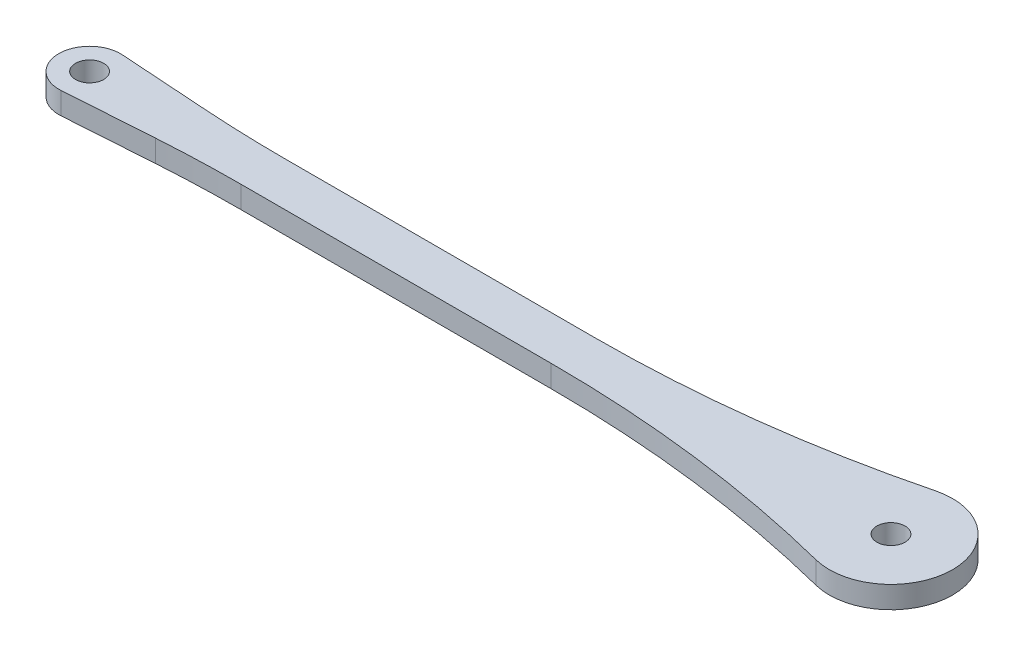
ISO-10303-21;
HEADER;
FILE_DESCRIPTION(('STEP AP214'),'2;1');
FILE_NAME('part.step','',(''),(''),'','','');
FILE_SCHEMA(('AUTOMOTIVE_DESIGN { 1 0 10303 214 1 1 1 1 }'));
ENDSEC;
DATA;
#1=APPLICATION_CONTEXT('core data for automotive mechanical design processes');
#2=APPLICATION_PROTOCOL_DEFINITION('international standard','automotive_design',2000,#1);
#3=PRODUCT_CONTEXT('',#1,'mechanical');
#4=PRODUCT('Part','Part','',(#3));
#5=PRODUCT_RELATED_PRODUCT_CATEGORY('part','',(#4));
#6=PRODUCT_DEFINITION_FORMATION('','',#4);
#7=PRODUCT_DEFINITION_CONTEXT('part definition',#1,'design');
#8=PRODUCT_DEFINITION('design','',#6,#7);
#9=PRODUCT_DEFINITION_SHAPE('','',#8);
#10=(LENGTH_UNIT() NAMED_UNIT(*) SI_UNIT(.MILLI.,.METRE.));
#11=(NAMED_UNIT(*) PLANE_ANGLE_UNIT() SI_UNIT($,.RADIAN.));
#12=(NAMED_UNIT(*) SI_UNIT($,.STERADIAN.) SOLID_ANGLE_UNIT());
#13=UNCERTAINTY_MEASURE_WITH_UNIT(LENGTH_MEASURE(1.E-05),#10,'distance_accuracy_value','');
#14=(GEOMETRIC_REPRESENTATION_CONTEXT(3) GLOBAL_UNCERTAINTY_ASSIGNED_CONTEXT((#13)) GLOBAL_UNIT_ASSIGNED_CONTEXT((#10,
#11,#12)) REPRESENTATION_CONTEXT('',''));
#15=CARTESIAN_POINT('',(0.,0.,0.));
#16=DIRECTION('',(0.,0.,1.));
#17=DIRECTION('',(1.,0.,0.));
#18=AXIS2_PLACEMENT_3D('',#15,#16,#17);
#19=CARTESIAN_POINT('',(0.038280708421993,3.175,-0.569714366068761));
#20=DIRECTION('',(0.0670416368978515,0.,-0.997750178612891));
#21=DIRECTION('',(-0.997750178612891,0.,-0.0670416368978515));
#22=AXIS2_PLACEMENT_3D('',#19,#20,#21);
#23=PLANE('',#22);
#24=DIRECTION('',(0.997750178612891,0.,0.0670416368978515));
#25=VECTOR('',#24,1.);
#26=CARTESIAN_POINT('',(0.038280708421993,3.175,-0.569714366068761));
#27=LINE('',#26,#25);
#28=CARTESIAN_POINT('',(-57.4869999239889,3.175,-4.4349995439343));
#29=VERTEX_POINT('',#28);
#30=CARTESIAN_POINT('',(-44.6882895003525,3.175,-3.57501824262793));
#31=VERTEX_POINT('',#30);
#32=EDGE_CURVE('E133',#29,#31,#27,.T.);
#33=ORIENTED_EDGE('',*,*,#32,.T.);
#34=DIRECTION('',(0.,-1.,0.));
#35=VECTOR('',#34,1.);
#36=CARTESIAN_POINT('',(-44.6882895003525,3.175,-3.57501824262793));
#37=LINE('',#36,#35);
#38=CARTESIAN_POINT('',(-44.6882895003525,0.,-3.57501824262793));
#39=VERTEX_POINT('',#38);
#40=EDGE_CURVE('E203',#31,#39,#37,.T.);
#41=ORIENTED_EDGE('',*,*,#40,.T.);
#42=DIRECTION('',(0.997750178612891,0.,0.0670416368978515));
#43=VECTOR('',#42,1.);
#44=CARTESIAN_POINT('',(0.038280708421993,0.,-0.569714366068761));
#45=LINE('',#44,#43);
#46=CARTESIAN_POINT('',(-57.4869999239889,0.,-4.4349995439343));
#47=VERTEX_POINT('',#46);
#48=EDGE_CURVE('E135',#47,#39,#45,.T.);
#49=ORIENTED_EDGE('',*,*,#48,.F.);
#50=DIRECTION('',(0.,-1.,0.));
#51=VECTOR('',#50,1.);
#52=CARTESIAN_POINT('',(-57.4869999239889,3.175,-4.4349995439343));
#53=LINE('',#52,#51);
#54=EDGE_CURVE('E130',#29,#47,#53,.T.);
#55=ORIENTED_EDGE('',*,*,#54,.F.);
#56=EDGE_LOOP('',(#33,#41,#49,#55));
#57=FACE_BOUND('',#56,.T.);
#58=ADVANCED_FACE('F46',(#57),#23,.T.);
#59=CARTESIAN_POINT('',(-57.7849999999999,3.175,0.));
#60=DIRECTION('',(0.,-1.,0.));
#61=DIRECTION('',(0.,0.,-1.));
#62=AXIS2_PLACEMENT_3D('',#59,#60,#61);
#63=CYLINDRICAL_SURFACE('',#62,4.445);
#64=CARTESIAN_POINT('',(-57.7849999999999,0.,0.));
#65=DIRECTION('',(0.,1.,0.));
#66=DIRECTION('',(0.,0.,1.));
#67=AXIS2_PLACEMENT_3D('',#64,#65,#66);
#68=CIRCLE('',#67,4.445);
#69=CARTESIAN_POINT('',(-57.4869999239889,0.,4.4349995439343));
#70=VERTEX_POINT('',#69);
#71=EDGE_CURVE('E178',#47,#70,#68,.T.);
#72=ORIENTED_EDGE('',*,*,#71,.T.);
#73=DIRECTION('',(0.,-1.,0.));
#74=VECTOR('',#73,1.);
#75=CARTESIAN_POINT('',(-57.4869999239889,3.175,4.4349995439343));
#76=LINE('',#75,#74);
#77=CARTESIAN_POINT('',(-57.4869999239889,3.175,4.4349995439343));
#78=VERTEX_POINT('',#77);
#79=EDGE_CURVE('E136',#78,#70,#76,.T.);
#80=ORIENTED_EDGE('',*,*,#79,.F.);
#81=CARTESIAN_POINT('',(-57.7849999999999,3.175,0.));
#82=DIRECTION('',(0.,1.,0.));
#83=DIRECTION('',(0.,0.,1.));
#84=AXIS2_PLACEMENT_3D('',#81,#82,#83);
#85=CIRCLE('',#84,4.445);
#86=EDGE_CURVE('E141',#29,#78,#85,.T.);
#87=ORIENTED_EDGE('',*,*,#86,.F.);
#88=ORIENTED_EDGE('',*,*,#54,.T.);
#89=EDGE_LOOP('',(#72,#80,#87,#88));
#90=FACE_BOUND('',#89,.T.);
#91=ADVANCED_FACE('F144',(#90),#63,.T.);
#92=CARTESIAN_POINT('',(0.0382807084219928,3.175,0.569714366068757));
#93=DIRECTION('',(0.0670416368978516,0.,0.997750178612891));
#94=DIRECTION('',(0.997750178612891,0.,-0.0670416368978516));
#95=AXIS2_PLACEMENT_3D('',#92,#93,#94);
#96=PLANE('',#95);
#97=DIRECTION('',(-0.997750178612891,0.,0.0670416368978516));
#98=VECTOR('',#97,1.);
#99=CARTESIAN_POINT('',(0.0382807084219928,0.,0.569714366068757));
#100=LINE('',#99,#98);
#101=CARTESIAN_POINT('',(-44.6882895003525,0.,3.57501824262793));
#102=VERTEX_POINT('',#101);
#103=EDGE_CURVE('E179',#102,#70,#100,.T.);
#104=ORIENTED_EDGE('',*,*,#103,.F.);
#105=DIRECTION('',(0.,-1.,0.));
#106=VECTOR('',#105,1.);
#107=CARTESIAN_POINT('',(-44.6882895003525,3.175,3.57501824262793));
#108=LINE('',#107,#106);
#109=CARTESIAN_POINT('',(-44.6882895003525,3.175,3.57501824262793));
#110=VERTEX_POINT('',#109);
#111=EDGE_CURVE('E65',#102,#110,#108,.F.);
#112=ORIENTED_EDGE('',*,*,#111,.T.);
#113=DIRECTION('',(-0.997750178612891,0.,0.0670416368978516));
#114=VECTOR('',#113,1.);
#115=CARTESIAN_POINT('',(0.0382807084219928,3.175,0.569714366068757));
#116=LINE('',#115,#114);
#117=EDGE_CURVE('E150',#110,#78,#116,.T.);
#118=ORIENTED_EDGE('',*,*,#117,.T.);
#119=ORIENTED_EDGE('',*,*,#79,.T.);
#120=EDGE_LOOP('',(#104,#112,#118,#119));
#121=FACE_BOUND('',#120,.T.);
#122=ADVANCED_FACE('F254',(#121),#96,.T.);
#123=CARTESIAN_POINT('',(0.,3.175,3.175));
#124=DIRECTION('',(0.,0.,1.));
#125=DIRECTION('',(1.,0.,0.));
#126=AXIS2_PLACEMENT_3D('',#123,#124,#125);
#127=PLANE('',#126);
#128=DIRECTION('',(-1.,0.,0.));
#129=VECTOR('',#128,1.);
#130=CARTESIAN_POINT('',(0.,3.175,3.175));
#131=LINE('',#130,#129);
#132=CARTESIAN_POINT('',(11.9460921268843,3.175,3.175));
#133=VERTEX_POINT('',#132);
#134=CARTESIAN_POINT('',(-32.7682864599144,3.175,3.175));
#135=VERTEX_POINT('',#134);
#136=EDGE_CURVE('E163',#133,#135,#131,.T.);
#137=ORIENTED_EDGE('',*,*,#136,.T.);
#138=DIRECTION('',(0.,-1.,0.));
#139=VECTOR('',#138,1.);
#140=CARTESIAN_POINT('',(-32.7682864599144,0.,3.175));
#141=LINE('',#140,#139);
#142=CARTESIAN_POINT('',(-32.7682864599144,0.,3.175));
#143=VERTEX_POINT('',#142);
#144=EDGE_CURVE('E208',#135,#143,#141,.T.);
#145=ORIENTED_EDGE('',*,*,#144,.T.);
#146=DIRECTION('',(-1.,0.,0.));
#147=VECTOR('',#146,1.);
#148=CARTESIAN_POINT('',(0.,0.,3.175));
#149=LINE('',#148,#147);
#150=CARTESIAN_POINT('',(11.9460921268843,0.,3.175));
#151=VERTEX_POINT('',#150);
#152=EDGE_CURVE('E185',#151,#143,#149,.T.);
#153=ORIENTED_EDGE('',*,*,#152,.F.);
#154=DIRECTION('',(0.,-1.,0.));
#155=VECTOR('',#154,1.);
#156=CARTESIAN_POINT('',(11.9460921268843,3.175,3.175));
#157=LINE('',#156,#155);
#158=EDGE_CURVE('E210',#151,#133,#157,.F.);
#159=ORIENTED_EDGE('',*,*,#158,.T.);
#160=EDGE_LOOP('',(#137,#145,#153,#159));
#161=FACE_BOUND('',#160,.T.);
#162=ADVANCED_FACE('F234',(#161),#127,.T.);
#163=CARTESIAN_POINT('',(57.7850000000001,3.175,0.));
#164=DIRECTION('',(0.,-1.,0.));
#165=DIRECTION('',(0.,0.,-1.));
#166=AXIS2_PLACEMENT_3D('',#163,#164,#165);
#167=CYLINDRICAL_SURFACE('',#166,8.89);
#168=CARTESIAN_POINT('',(57.7850000000001,0.,0.));
#169=DIRECTION('',(0.,1.,0.));
#170=DIRECTION('',(0.,0.,1.));
#171=AXIS2_PLACEMENT_3D('',#168,#169,#170);
#172=CIRCLE('',#171,8.89);
#173=CARTESIAN_POINT('',(55.6021948631851,0.,8.61785714285714));
#174=VERTEX_POINT('',#173);
#175=CARTESIAN_POINT('',(55.6021948631851,0.,-8.61785714285714));
#176=VERTEX_POINT('',#175);
#177=EDGE_CURVE('E184',#174,#176,#172,.T.);
#178=ORIENTED_EDGE('',*,*,#177,.T.);
#179=DIRECTION('',(0.,-1.,0.));
#180=VECTOR('',#179,1.);
#181=CARTESIAN_POINT('',(55.6021948631851,3.175,-8.61785714285714));
#182=LINE('',#181,#180);
#183=CARTESIAN_POINT('',(55.6021948631851,3.175,-8.61785714285714));
#184=VERTEX_POINT('',#183);
#185=EDGE_CURVE('E204',#176,#184,#182,.F.);
#186=ORIENTED_EDGE('',*,*,#185,.T.);
#187=CARTESIAN_POINT('',(57.7850000000001,3.175,0.));
#188=DIRECTION('',(0.,1.,0.));
#189=DIRECTION('',(0.,0.,1.));
#190=AXIS2_PLACEMENT_3D('',#187,#188,#189);
#191=CIRCLE('',#190,8.89);
#192=CARTESIAN_POINT('',(55.6021948631851,3.175,8.61785714285714));
#193=VERTEX_POINT('',#192);
#194=EDGE_CURVE('E164',#193,#184,#191,.T.);
#195=ORIENTED_EDGE('',*,*,#194,.F.);
#196=DIRECTION('',(0.,-1.,0.));
#197=VECTOR('',#196,1.);
#198=CARTESIAN_POINT('',(55.6021948631851,3.175,8.61785714285714));
#199=LINE('',#198,#197);
#200=EDGE_CURVE('E196',#193,#174,#199,.T.);
#201=ORIENTED_EDGE('',*,*,#200,.T.);
#202=EDGE_LOOP('',(#178,#186,#195,#201));
#203=FACE_BOUND('',#202,.T.);
#204=ADVANCED_FACE('F241',(#203),#167,.T.);
#205=CARTESIAN_POINT('',(0.,3.175,-3.175));
#206=DIRECTION('',(0.,0.,1.));
#207=DIRECTION('',(1.,0.,0.));
#208=AXIS2_PLACEMENT_3D('',#205,#206,#207);
#209=PLANE('',#208);
#210=DIRECTION('',(-1.,0.,0.));
#211=VECTOR('',#210,1.);
#212=CARTESIAN_POINT('',(0.,3.175,-3.175));
#213=LINE('',#212,#211);
#214=CARTESIAN_POINT('',(11.9460921268843,3.175,-3.175));
#215=VERTEX_POINT('',#214);
#216=CARTESIAN_POINT('',(-32.7682864599145,3.175,-3.175));
#217=VERTEX_POINT('',#216);
#218=EDGE_CURVE('E166',#215,#217,#213,.T.);
#219=ORIENTED_EDGE('',*,*,#218,.F.);
#220=DIRECTION('',(0.,1.,0.));
#221=VECTOR('',#220,1.);
#222=CARTESIAN_POINT('',(11.9460921268843,0.,-3.175));
#223=LINE('',#222,#221);
#224=CARTESIAN_POINT('',(11.9460921268843,0.,-3.175));
#225=VERTEX_POINT('',#224);
#226=EDGE_CURVE('E198',#215,#225,#223,.F.);
#227=ORIENTED_EDGE('',*,*,#226,.T.);
#228=DIRECTION('',(-1.,0.,0.));
#229=VECTOR('',#228,1.);
#230=CARTESIAN_POINT('',(0.,0.,-3.175));
#231=LINE('',#230,#229);
#232=CARTESIAN_POINT('',(-32.7682864599145,0.,-3.175));
#233=VERTEX_POINT('',#232);
#234=EDGE_CURVE('E189',#225,#233,#231,.T.);
#235=ORIENTED_EDGE('',*,*,#234,.T.);
#236=DIRECTION('',(0.,-1.,0.));
#237=VECTOR('',#236,1.);
#238=CARTESIAN_POINT('',(-32.7682864599145,3.175,-3.175));
#239=LINE('',#238,#237);
#240=EDGE_CURVE('E139',#233,#217,#239,.F.);
#241=ORIENTED_EDGE('',*,*,#240,.T.);
#242=EDGE_LOOP('',(#219,#227,#235,#241));
#243=FACE_BOUND('',#242,.T.);
#244=ADVANCED_FACE('F247',(#243),#209,.F.);
#245=CARTESIAN_POINT('',(-57.7849999999999,3.175,0.));
#246=DIRECTION('',(0.,-1.,0.));
#247=DIRECTION('',(0.,0.,-1.));
#248=AXIS2_PLACEMENT_3D('',#245,#246,#247);
#249=CYLINDRICAL_SURFACE('',#248,2.03200000000001);
#250=CARTESIAN_POINT('',(-57.7849999999999,3.175,0.));
#251=DIRECTION('',(0.,1.,0.));
#252=DIRECTION('',(0.,0.,1.));
#253=AXIS2_PLACEMENT_3D('',#250,#251,#252);
#254=CIRCLE('',#253,2.03200000000001);
#255=CARTESIAN_POINT('',(-57.7849999999999,3.175,2.03200000000001));
#256=VERTEX_POINT('',#255);
#257=EDGE_CURVE('E153',#256,#256,#254,.T.);
#258=ORIENTED_EDGE('',*,*,#257,.T.);
#259=EDGE_LOOP('',(#258));
#260=FACE_BOUND('',#259,.T.);
#261=CARTESIAN_POINT('',(-57.7849999999999,0.,0.));
#262=DIRECTION('',(0.,1.,0.));
#263=DIRECTION('',(0.,0.,1.));
#264=AXIS2_PLACEMENT_3D('',#261,#262,#263);
#265=CIRCLE('',#264,2.03200000000001);
#266=CARTESIAN_POINT('',(-57.7849999999999,0.,2.03200000000001));
#267=VERTEX_POINT('',#266);
#268=EDGE_CURVE('E172',#267,#267,#265,.T.);
#269=ORIENTED_EDGE('',*,*,#268,.F.);
#270=EDGE_LOOP('',(#269));
#271=FACE_BOUND('',#270,.T.);
#272=ADVANCED_FACE('F271',(#260,#271),#249,.F.);
#273=CARTESIAN_POINT('',(57.7850000000001,3.175,0.));
#274=DIRECTION('',(0.,-1.,0.));
#275=DIRECTION('',(0.,0.,-1.));
#276=AXIS2_PLACEMENT_3D('',#273,#274,#275);
#277=CYLINDRICAL_SURFACE('',#276,2.03200000000001);
#278=CARTESIAN_POINT('',(57.7850000000001,3.175,0.));
#279=DIRECTION('',(0.,1.,0.));
#280=DIRECTION('',(0.,0.,1.));
#281=AXIS2_PLACEMENT_3D('',#278,#279,#280);
#282=CIRCLE('',#281,2.03200000000001);
#283=CARTESIAN_POINT('',(57.7850000000001,3.175,2.03200000000001));
#284=VERTEX_POINT('',#283);
#285=EDGE_CURVE('E171',#284,#284,#282,.T.);
#286=ORIENTED_EDGE('',*,*,#285,.T.);
#287=EDGE_LOOP('',(#286));
#288=FACE_BOUND('',#287,.T.);
#289=CARTESIAN_POINT('',(57.7850000000001,0.,0.));
#290=DIRECTION('',(0.,1.,0.));
#291=DIRECTION('',(0.,0.,1.));
#292=AXIS2_PLACEMENT_3D('',#289,#290,#291);
#293=CIRCLE('',#292,2.03200000000001);
#294=CARTESIAN_POINT('',(57.7850000000001,0.,2.03200000000001));
#295=VERTEX_POINT('',#294);
#296=EDGE_CURVE('E160',#295,#295,#293,.T.);
#297=ORIENTED_EDGE('',*,*,#296,.F.);
#298=EDGE_LOOP('',(#297));
#299=FACE_BOUND('',#298,.T.);
#300=ADVANCED_FACE('F276',(#288,#299),#277,.F.);
#301=CARTESIAN_POINT('',(0.,3.175,0.));
#302=DIRECTION('',(0.,1.,0.));
#303=DIRECTION('',(0.,0.,1.));
#304=AXIS2_PLACEMENT_3D('',#301,#302,#303);
#305=PLANE('',#304);
#306=ORIENTED_EDGE('',*,*,#257,.F.);
#307=EDGE_LOOP('',(#306));
#308=FACE_BOUND('',#307,.T.);
#309=ORIENTED_EDGE('',*,*,#32,.F.);
#310=ORIENTED_EDGE('',*,*,#86,.T.);
#311=ORIENTED_EDGE('',*,*,#117,.F.);
#312=CARTESIAN_POINT('',(-32.7682864599145,3.175,180.975));
#313=DIRECTION('',(0.,1.,0.));
#314=DIRECTION('',(0.,0.,1.));
#315=AXIS2_PLACEMENT_3D('',#312,#313,#314);
#316=CIRCLE('',#315,177.8);
#317=EDGE_CURVE('E224',#110,#135,#316,.F.);
#318=ORIENTED_EDGE('',*,*,#317,.T.);
#319=ORIENTED_EDGE('',*,*,#136,.F.);
#320=CARTESIAN_POINT('',(11.9460921268843,3.175,180.975));
#321=DIRECTION('',(0.,1.,0.));
#322=DIRECTION('',(0.,0.,1.));
#323=AXIS2_PLACEMENT_3D('',#320,#321,#322);
#324=CIRCLE('',#323,177.8);
#325=EDGE_CURVE('E11',#133,#193,#324,.F.);
#326=ORIENTED_EDGE('',*,*,#325,.T.);
#327=ORIENTED_EDGE('',*,*,#194,.T.);
#328=CARTESIAN_POINT('',(11.9460921268843,3.175,-180.975));
#329=DIRECTION('',(0.,1.,0.));
#330=DIRECTION('',(0.,0.,1.));
#331=AXIS2_PLACEMENT_3D('',#328,#329,#330);
#332=CIRCLE('',#331,177.8);
#333=EDGE_CURVE('E220',#184,#215,#332,.F.);
#334=ORIENTED_EDGE('',*,*,#333,.T.);
#335=ORIENTED_EDGE('',*,*,#218,.T.);
#336=CARTESIAN_POINT('',(-32.7682864599145,3.175,-180.975));
#337=DIRECTION('',(0.,1.,0.));
#338=DIRECTION('',(0.,0.,1.));
#339=AXIS2_PLACEMENT_3D('',#336,#337,#338);
#340=CIRCLE('',#339,177.8);
#341=EDGE_CURVE('E152',#217,#31,#340,.F.);
#342=ORIENTED_EDGE('',*,*,#341,.T.);
#343=EDGE_LOOP('',(#309,#310,#311,#318,#319,#326,#327,#334,#335,#342));
#344=FACE_BOUND('',#343,.T.);
#345=ORIENTED_EDGE('',*,*,#285,.F.);
#346=EDGE_LOOP('',(#345));
#347=FACE_BOUND('',#346,.T.);
#348=ADVANCED_FACE('F148',(#308,#344,#347),#305,.T.);
#349=CARTESIAN_POINT('',(0.,0.,0.));
#350=DIRECTION('',(0.,1.,0.));
#351=DIRECTION('',(0.,0.,1.));
#352=AXIS2_PLACEMENT_3D('',#349,#350,#351);
#353=PLANE('',#352);
#354=ORIENTED_EDGE('',*,*,#268,.T.);
#355=EDGE_LOOP('',(#354));
#356=FACE_BOUND('',#355,.T.);
#357=ORIENTED_EDGE('',*,*,#48,.T.);
#358=CARTESIAN_POINT('',(-32.7682864599145,0.,-180.975));
#359=DIRECTION('',(0.,1.,0.));
#360=DIRECTION('',(0.,0.,1.));
#361=AXIS2_PLACEMENT_3D('',#358,#359,#360);
#362=CIRCLE('',#361,177.8);
#363=EDGE_CURVE('E219',#39,#233,#362,.T.);
#364=ORIENTED_EDGE('',*,*,#363,.T.);
#365=ORIENTED_EDGE('',*,*,#234,.F.);
#366=CARTESIAN_POINT('',(11.9460921268843,0.,-180.975));
#367=DIRECTION('',(0.,1.,0.));
#368=DIRECTION('',(0.,0.,1.));
#369=AXIS2_PLACEMENT_3D('',#366,#367,#368);
#370=CIRCLE('',#369,177.8);
#371=EDGE_CURVE('E213',#225,#176,#370,.T.);
#372=ORIENTED_EDGE('',*,*,#371,.T.);
#373=ORIENTED_EDGE('',*,*,#177,.F.);
#374=CARTESIAN_POINT('',(11.9460921268843,0.,180.975));
#375=DIRECTION('',(0.,1.,0.));
#376=DIRECTION('',(0.,0.,1.));
#377=AXIS2_PLACEMENT_3D('',#374,#375,#376);
#378=CIRCLE('',#377,177.8);
#379=EDGE_CURVE('E54',#174,#151,#378,.T.);
#380=ORIENTED_EDGE('',*,*,#379,.T.);
#381=ORIENTED_EDGE('',*,*,#152,.T.);
#382=CARTESIAN_POINT('',(-32.7682864599145,0.,180.975));
#383=DIRECTION('',(0.,1.,0.));
#384=DIRECTION('',(0.,0.,1.));
#385=AXIS2_PLACEMENT_3D('',#382,#383,#384);
#386=CIRCLE('',#385,177.8);
#387=EDGE_CURVE('E66',#143,#102,#386,.T.);
#388=ORIENTED_EDGE('',*,*,#387,.T.);
#389=ORIENTED_EDGE('',*,*,#103,.T.);
#390=ORIENTED_EDGE('',*,*,#71,.F.);
#391=EDGE_LOOP('',(#357,#364,#365,#372,#373,#380,#381,#388,#389,#390));
#392=FACE_BOUND('',#391,.T.);
#393=ORIENTED_EDGE('',*,*,#296,.T.);
#394=EDGE_LOOP('',(#393));
#395=FACE_BOUND('',#394,.T.);
#396=ADVANCED_FACE('F226',(#356,#392,#395),#353,.F.);
#397=CARTESIAN_POINT('',(11.9460921268843,3.175,-180.975));
#398=DIRECTION('',(0.,-1.,0.));
#399=DIRECTION('',(0.,0.,-1.));
#400=AXIS2_PLACEMENT_3D('',#397,#398,#399);
#401=CYLINDRICAL_SURFACE('',#400,177.8);
#402=ORIENTED_EDGE('',*,*,#333,.F.);
#403=ORIENTED_EDGE('',*,*,#185,.F.);
#404=ORIENTED_EDGE('',*,*,#371,.F.);
#405=ORIENTED_EDGE('',*,*,#226,.F.);
#406=EDGE_LOOP('',(#402,#403,#404,#405));
#407=FACE_BOUND('',#406,.T.);
#408=ADVANCED_FACE('F242',(#407),#401,.F.);
#409=CARTESIAN_POINT('',(-32.7682864599145,3.175,-180.975));
#410=DIRECTION('',(0.,-1.,0.));
#411=DIRECTION('',(0.,0.,-1.));
#412=AXIS2_PLACEMENT_3D('',#409,#410,#411);
#413=CYLINDRICAL_SURFACE('',#412,177.8);
#414=ORIENTED_EDGE('',*,*,#341,.F.);
#415=ORIENTED_EDGE('',*,*,#240,.F.);
#416=ORIENTED_EDGE('',*,*,#363,.F.);
#417=ORIENTED_EDGE('',*,*,#40,.F.);
#418=EDGE_LOOP('',(#414,#415,#416,#417));
#419=FACE_BOUND('',#418,.T.);
#420=ADVANCED_FACE('F255',(#419),#413,.F.);
#421=CARTESIAN_POINT('',(-32.7682864599145,3.175,180.975));
#422=DIRECTION('',(0.,1.,0.));
#423=DIRECTION('',(0.,0.,1.));
#424=AXIS2_PLACEMENT_3D('',#421,#422,#423);
#425=CYLINDRICAL_SURFACE('',#424,177.8);
#426=ORIENTED_EDGE('',*,*,#317,.F.);
#427=ORIENTED_EDGE('',*,*,#111,.F.);
#428=ORIENTED_EDGE('',*,*,#387,.F.);
#429=ORIENTED_EDGE('',*,*,#144,.F.);
#430=EDGE_LOOP('',(#426,#427,#428,#429));
#431=FACE_BOUND('',#430,.T.);
#432=ADVANCED_FACE('F256',(#431),#425,.F.);
#433=CARTESIAN_POINT('',(11.9460921268843,3.175,180.975));
#434=DIRECTION('',(0.,-1.,0.));
#435=DIRECTION('',(0.,0.,-1.));
#436=AXIS2_PLACEMENT_3D('',#433,#434,#435);
#437=CYLINDRICAL_SURFACE('',#436,177.8);
#438=ORIENTED_EDGE('',*,*,#325,.F.);
#439=ORIENTED_EDGE('',*,*,#158,.F.);
#440=ORIENTED_EDGE('',*,*,#379,.F.);
#441=ORIENTED_EDGE('',*,*,#200,.F.);
#442=EDGE_LOOP('',(#438,#439,#440,#441));
#443=FACE_BOUND('',#442,.T.);
#444=ADVANCED_FACE('F48',(#443),#437,.F.);
#445=CLOSED_SHELL('',(#58,#91,#122,#162,#204,#244,#272,#300,#348,#396,#408,#420,#432,#444));
#446=MANIFOLD_SOLID_BREP('B2',#445);
#447=ADVANCED_BREP_SHAPE_REPRESENTATION('',(#18,#446),#14);
#448=SHAPE_DEFINITION_REPRESENTATION(#9,#447);
ENDSEC;
END-ISO-10303-21;
